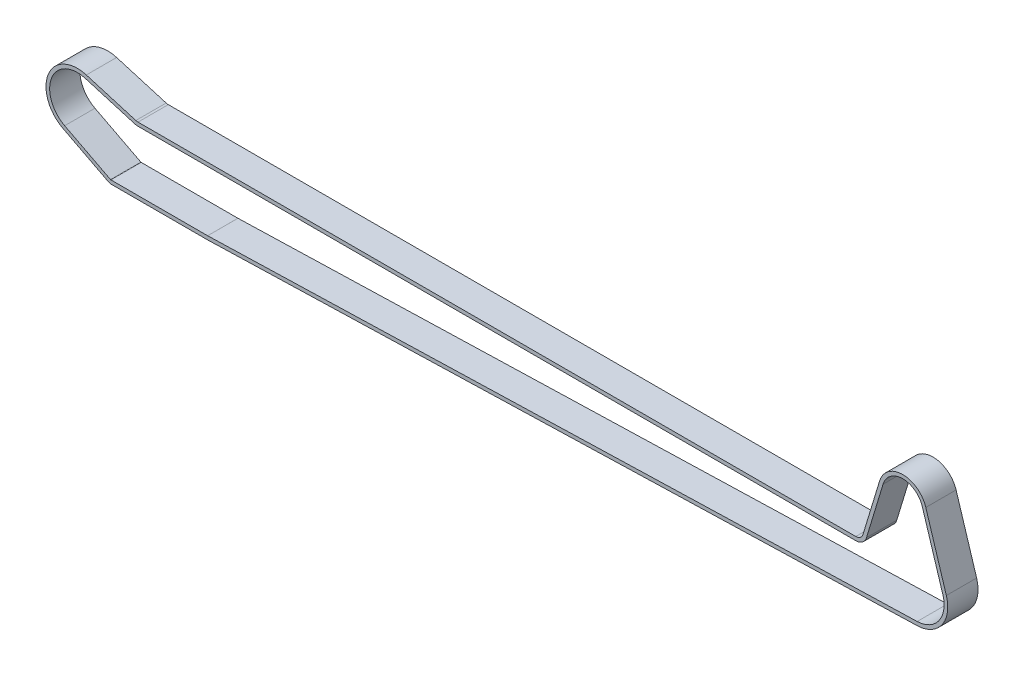
ISO-10303-21;
HEADER;
FILE_DESCRIPTION(('STEP AP214'),'2;1');
FILE_NAME('part.step','',(''),(''),'','','');
FILE_SCHEMA(('AUTOMOTIVE_DESIGN { 1 0 10303 214 1 1 1 1 }'));
ENDSEC;
DATA;
#1=APPLICATION_CONTEXT('core data for automotive mechanical design processes');
#2=APPLICATION_PROTOCOL_DEFINITION('international standard','automotive_design',2000,#1);
#3=PRODUCT_CONTEXT('',#1,'mechanical');
#4=PRODUCT('Part','Part','',(#3));
#5=PRODUCT_RELATED_PRODUCT_CATEGORY('part','',(#4));
#6=PRODUCT_DEFINITION_FORMATION('','',#4);
#7=PRODUCT_DEFINITION_CONTEXT('part definition',#1,'design');
#8=PRODUCT_DEFINITION('design','',#6,#7);
#9=PRODUCT_DEFINITION_SHAPE('','',#8);
#10=(LENGTH_UNIT() NAMED_UNIT(*) SI_UNIT(.MILLI.,.METRE.));
#11=(NAMED_UNIT(*) PLANE_ANGLE_UNIT() SI_UNIT($,.RADIAN.));
#12=(NAMED_UNIT(*) SI_UNIT($,.STERADIAN.) SOLID_ANGLE_UNIT());
#13=UNCERTAINTY_MEASURE_WITH_UNIT(LENGTH_MEASURE(1.E-05),#10,'distance_accuracy_value','');
#14=(GEOMETRIC_REPRESENTATION_CONTEXT(3) GLOBAL_UNCERTAINTY_ASSIGNED_CONTEXT((#13)) GLOBAL_UNIT_ASSIGNED_CONTEXT((#10,
#11,#12)) REPRESENTATION_CONTEXT('',''));
#15=CARTESIAN_POINT('',(0.,0.,0.));
#16=DIRECTION('',(0.,0.,1.));
#17=DIRECTION('',(1.,0.,0.));
#18=AXIS2_PLACEMENT_3D('',#15,#16,#17);
#19=CARTESIAN_POINT('',(134.,22.5,5.));
#20=DIRECTION('',(0.,0.,1.));
#21=DIRECTION('',(1.,0.,0.));
#22=AXIS2_PLACEMENT_3D('',#19,#20,#21);
#23=PLANE('',#22);
#24=DIRECTION('',(1.,0.,0.));
#25=VECTOR('',#24,1.);
#26=CARTESIAN_POINT('',(-127.791520656729,-17.2,5.));
#27=LINE('',#26,#25);
#28=CARTESIAN_POINT('',(-127.427119835818,-17.2,5.));
#29=VERTEX_POINT('',#28);
#30=CARTESIAN_POINT('',(-95.504374774076,-17.2,5.));
#31=VERTEX_POINT('',#30);
#32=EDGE_CURVE('E337',#29,#31,#27,.T.);
#33=ORIENTED_EDGE('',*,*,#32,.T.);
#34=CARTESIAN_POINT('',(-95.504374774076,-15.7,5.));
#35=DIRECTION('',(0.,0.,1.));
#36=DIRECTION('',(1.,0.,0.));
#37=AXIS2_PLACEMENT_3D('',#34,#35,#36);
#38=CIRCLE('',#37,1.5);
#39=CARTESIAN_POINT('',(-95.4606363343705,-17.1993621806929,5.));
#40=VERTEX_POINT('',#39);
#41=EDGE_CURVE('E43',#31,#40,#38,.T.);
#42=ORIENTED_EDGE('',*,*,#41,.T.);
#43=DIRECTION('',(0.999574787128591,0.0291589598036643,0.));
#44=VECTOR('',#43,1.);
#45=CARTESIAN_POINT('',(-95.4825009036976,-17.2,5.));
#46=LINE('',#45,#44);
#47=CARTESIAN_POINT('',(138.802378413164,-10.3655905425235,5.));
#48=VERTEX_POINT('',#47);
#49=EDGE_CURVE('E339',#40,#48,#46,.T.);
#50=ORIENTED_EDGE('',*,*,#49,.T.);
#51=CARTESIAN_POINT('',(138.5,0.,5.));
#52=DIRECTION('',(0.,0.,1.));
#53=DIRECTION('',(-1.,0.,0.));
#54=AXIS2_PLACEMENT_3D('',#51,#52,#53);
#55=CIRCLE('',#54,10.37);
#56=CARTESIAN_POINT('',(148.401478885599,3.08182022156419,5.));
#57=VERTEX_POINT('',#56);
#58=EDGE_CURVE('E341',#48,#57,#55,.T.);
#59=ORIENTED_EDGE('',*,*,#58,.T.);
#60=DIRECTION('',(-0.29718613515566,0.95481956466719,0.));
#61=VECTOR('',#60,1.);
#62=CARTESIAN_POINT('',(141.619460126044,24.8715453585422,5.));
#63=LINE('',#62,#61);
#64=CARTESIAN_POINT('',(141.619460126044,24.8715453585422,5.));
#65=VERTEX_POINT('',#64);
#66=EDGE_CURVE('E343',#57,#65,#63,.T.);
#67=ORIENTED_EDGE('',*,*,#66,.T.);
#68=CARTESIAN_POINT('',(134.,22.5,5.));
#69=DIRECTION('',(0.,0.,1.));
#70=DIRECTION('',(1.,0.,0.));
#71=AXIS2_PLACEMENT_3D('',#68,#69,#70);
#72=CIRCLE('',#71,7.98);
#73=CARTESIAN_POINT('',(126.364584033721,24.819660109132,5.));
#74=VERTEX_POINT('',#73);
#75=EDGE_CURVE('E319',#65,#74,#72,.T.);
#76=ORIENTED_EDGE('',*,*,#75,.T.);
#77=DIRECTION('',(-0.290684224202009,-0.956819043393303,0.));
#78=VECTOR('',#77,1.);
#79=CARTESIAN_POINT('',(120.882047608483,6.77328943949498,5.));
#80=LINE('',#79,#78);
#81=CARTESIAN_POINT('',(120.882047608483,6.77328943949498,5.));
#82=VERTEX_POINT('',#81);
#83=EDGE_CURVE('E322',#74,#82,#80,.T.);
#84=ORIENTED_EDGE('',*,*,#83,.T.);
#85=CARTESIAN_POINT('',(118.49,7.5,5.));
#86=DIRECTION('',(0.,0.,-1.));
#87=DIRECTION('',(-1.,0.,0.));
#88=AXIS2_PLACEMENT_3D('',#85,#86,#87);
#89=CIRCLE('',#88,2.5);
#90=CARTESIAN_POINT('',(118.49,5.,5.));
#91=VERTEX_POINT('',#90);
#92=EDGE_CURVE('E325',#82,#91,#89,.T.);
#93=ORIENTED_EDGE('',*,*,#92,.T.);
#94=DIRECTION('',(-1.,0.,0.));
#95=VECTOR('',#94,1.);
#96=CARTESIAN_POINT('',(-118.49,5.,5.));
#97=LINE('',#96,#95);
#98=CARTESIAN_POINT('',(-118.49,5.,5.));
#99=VERTEX_POINT('',#98);
#100=EDGE_CURVE('E327',#91,#99,#97,.T.);
#101=ORIENTED_EDGE('',*,*,#100,.T.);
#102=CARTESIAN_POINT('',(-118.49,7.5,5.));
#103=DIRECTION('',(0.,0.,-1.));
#104=DIRECTION('',(1.,0.,0.));
#105=AXIS2_PLACEMENT_3D('',#102,#103,#104);
#106=CIRCLE('',#105,2.5);
#107=CARTESIAN_POINT('',(-119.199434764562,5.10277195185128,5.));
#108=VERTEX_POINT('',#107);
#109=EDGE_CURVE('E329',#99,#108,#106,.T.);
#110=ORIENTED_EDGE('',*,*,#109,.T.);
#111=DIRECTION('',(-0.958891219259489,0.283773905824779,0.));
#112=VECTOR('',#111,1.);
#113=CARTESIAN_POINT('',(-135.557264596597,9.9437019437209,5.));
#114=LINE('',#113,#112);
#115=CARTESIAN_POINT('',(-135.557264596597,9.9437019437209,5.));
#116=VERTEX_POINT('',#115);
#117=EDGE_CURVE('E331',#108,#116,#114,.T.);
#118=ORIENTED_EDGE('',*,*,#117,.T.);
#119=CARTESIAN_POINT('',(-138.5,0.,5.));
#120=DIRECTION('',(0.,0.,1.));
#121=DIRECTION('',(1.,0.,0.));
#122=AXIS2_PLACEMENT_3D('',#119,#120,#121);
#123=CIRCLE('',#122,10.37);
#124=CARTESIAN_POINT('',(-143.257666119284,-9.21420170700752,5.));
#125=VERTEX_POINT('',#124);
#126=EDGE_CURVE('E333',#116,#125,#123,.T.);
#127=ORIENTED_EDGE('',*,*,#126,.T.);
#128=DIRECTION('',(0.888544041177196,-0.458791332621376,0.));
#129=VECTOR('',#128,1.);
#130=CARTESIAN_POINT('',(-143.257666119284,-9.21420170700752,5.));
#131=LINE('',#130,#129);
#132=CARTESIAN_POINT('',(-128.11530683475,-17.0328160617658,5.));
#133=VERTEX_POINT('',#132);
#134=EDGE_CURVE('E335',#125,#133,#131,.T.);
#135=ORIENTED_EDGE('',*,*,#134,.T.);
#136=CARTESIAN_POINT('',(-127.427119835818,-15.7,5.));
#137=DIRECTION('',(0.,0.,1.));
#138=DIRECTION('',(1.,0.,0.));
#139=AXIS2_PLACEMENT_3D('',#136,#137,#138);
#140=CIRCLE('',#139,1.5);
#141=EDGE_CURVE('E426',#133,#29,#140,.T.);
#142=ORIENTED_EDGE('',*,*,#141,.T.);
#143=EDGE_LOOP('',(#33,#42,#50,#59,#67,#76,#84,#93,#101,#110,#118,#127,#135,#142));
#144=FACE_BOUND('',#143,.T.);
#145=DIRECTION('',(1.,0.,0.));
#146=VECTOR('',#145,1.);
#147=CARTESIAN_POINT('',(-127.5,-16.,5.));
#148=LINE('',#147,#146);
#149=CARTESIAN_POINT('',(-127.427119835818,-16.,5.));
#150=VERTEX_POINT('',#149);
#151=CARTESIAN_POINT('',(-95.5043747740756,-16.,5.));
#152=VERTEX_POINT('',#151);
#153=EDGE_CURVE('E234',#150,#152,#148,.T.);
#154=ORIENTED_EDGE('',*,*,#153,.F.);
#155=CARTESIAN_POINT('',(-127.427119835818,-15.7,5.));
#156=DIRECTION('',(0.,0.,1.));
#157=DIRECTION('',(1.,0.,0.));
#158=AXIS2_PLACEMENT_3D('',#155,#156,#157);
#159=CIRCLE('',#158,0.3);
#160=CARTESIAN_POINT('',(-127.564757235604,-15.9665632123532,5.));
#161=VERTEX_POINT('',#160);
#162=EDGE_CURVE('E413',#150,#161,#159,.F.);
#163=ORIENTED_EDGE('',*,*,#162,.T.);
#164=DIRECTION('',(0.888544041177196,-0.458791332621376,0.));
#165=VECTOR('',#164,1.);
#166=CARTESIAN_POINT('',(-142.707116520138,-8.14794885759488,5.));
#167=LINE('',#166,#165);
#168=CARTESIAN_POINT('',(-142.707116520138,-8.14794885759489,5.));
#169=VERTEX_POINT('',#168);
#170=EDGE_CURVE('E301',#169,#161,#167,.T.);
#171=ORIENTED_EDGE('',*,*,#170,.F.);
#172=CARTESIAN_POINT('',(-138.5,0.,5.));
#173=DIRECTION('',(0.,0.,1.));
#174=DIRECTION('',(1.,0.,0.));
#175=AXIS2_PLACEMENT_3D('',#172,#173,#174);
#176=CIRCLE('',#175,9.16999999999999);
#177=CARTESIAN_POINT('',(-135.897793283587,8.79303248060951,5.));
#178=VERTEX_POINT('',#177);
#179=EDGE_CURVE('E265',#178,#169,#176,.T.);
#180=ORIENTED_EDGE('',*,*,#179,.F.);
#181=DIRECTION('',(-0.958891219259489,0.283773905824779,0.));
#182=VECTOR('',#181,1.);
#183=CARTESIAN_POINT('',(-135.897793283587,8.79303248060951,5.));
#184=LINE('',#183,#182);
#185=CARTESIAN_POINT('',(-119.539963451552,3.95210248873989,5.));
#186=VERTEX_POINT('',#185);
#187=EDGE_CURVE('E262',#186,#178,#184,.T.);
#188=ORIENTED_EDGE('',*,*,#187,.F.);
#189=CARTESIAN_POINT('',(-118.49,7.5,5.));
#190=DIRECTION('',(0.,0.,-1.));
#191=DIRECTION('',(1.,0.,0.));
#192=AXIS2_PLACEMENT_3D('',#189,#190,#191);
#193=CIRCLE('',#192,3.7);
#194=CARTESIAN_POINT('',(-118.49,3.8,5.));
#195=VERTEX_POINT('',#194);
#196=EDGE_CURVE('E260',#195,#186,#193,.T.);
#197=ORIENTED_EDGE('',*,*,#196,.F.);
#198=DIRECTION('',(-1.,0.,0.));
#199=VECTOR('',#198,1.);
#200=CARTESIAN_POINT('',(-118.49,3.8,5.));
#201=LINE('',#200,#199);
#202=CARTESIAN_POINT('',(118.49,3.80000000000001,5.));
#203=VERTEX_POINT('',#202);
#204=EDGE_CURVE('E258',#203,#195,#201,.T.);
#205=ORIENTED_EDGE('',*,*,#204,.F.);
#206=CARTESIAN_POINT('',(118.49,7.5,5.));
#207=DIRECTION('',(0.,0.,-1.));
#208=DIRECTION('',(-1.,0.,0.));
#209=AXIS2_PLACEMENT_3D('',#206,#207,#208);
#210=CIRCLE('',#209,3.69999999999999);
#211=CARTESIAN_POINT('',(122.030230460555,6.42446837045257,5.));
#212=VERTEX_POINT('',#211);
#213=EDGE_CURVE('E256',#212,#203,#210,.T.);
#214=ORIENTED_EDGE('',*,*,#213,.F.);
#215=DIRECTION('',(-0.290684224202009,-0.956819043393303,0.));
#216=VECTOR('',#215,1.);
#217=CARTESIAN_POINT('',(122.030230460555,6.42446837045257,5.));
#218=LINE('',#217,#216);
#219=CARTESIAN_POINT('',(127.512766885793,24.4708390400896,5.));
#220=VERTEX_POINT('',#219);
#221=EDGE_CURVE('E254',#220,#212,#218,.T.);
#222=ORIENTED_EDGE('',*,*,#221,.F.);
#223=CARTESIAN_POINT('',(134.,22.5,5.));
#224=DIRECTION('',(0.,0.,1.));
#225=DIRECTION('',(1.,0.,0.));
#226=AXIS2_PLACEMENT_3D('',#223,#224,#225);
#227=CIRCLE('',#226,6.77999999999998);
#228=CARTESIAN_POINT('',(140.473676648444,24.5149219963554,5.));
#229=VERTEX_POINT('',#228);
#230=EDGE_CURVE('E249',#229,#220,#227,.T.);
#231=ORIENTED_EDGE('',*,*,#230,.F.);
#232=DIRECTION('',(-0.297186135155662,0.954819564667189,0.));
#233=VECTOR('',#232,1.);
#234=CARTESIAN_POINT('',(140.473676648444,24.5149219963554,5.));
#235=LINE('',#234,#233);
#236=CARTESIAN_POINT('',(147.255695407998,2.7251968593774,5.));
#237=VERTEX_POINT('',#236);
#238=EDGE_CURVE('E247',#237,#229,#235,.T.);
#239=ORIENTED_EDGE('',*,*,#238,.F.);
#240=CARTESIAN_POINT('',(138.5,0.,5.));
#241=DIRECTION('',(0.,0.,1.));
#242=DIRECTION('',(-1.,0.,0.));
#243=AXIS2_PLACEMENT_3D('',#240,#241,#242);
#244=CIRCLE('',#243,9.16999999999999);
#245=CARTESIAN_POINT('',(138.7673876614,-9.16610079796918,5.));
#246=VERTEX_POINT('',#245);
#247=EDGE_CURVE('E233',#246,#237,#244,.T.);
#248=ORIENTED_EDGE('',*,*,#247,.F.);
#249=DIRECTION('',(0.999574787128591,0.0291589598036644,0.));
#250=VECTOR('',#249,1.);
#251=CARTESIAN_POINT('',(-95.5,-16.,5.));
#252=LINE('',#251,#250);
#253=CARTESIAN_POINT('',(-95.4956270861345,-15.9998724361386,5.));
#254=VERTEX_POINT('',#253);
#255=EDGE_CURVE('E222',#254,#246,#252,.T.);
#256=ORIENTED_EDGE('',*,*,#255,.F.);
#257=CARTESIAN_POINT('',(-95.5043747740756,-15.7,5.));
#258=DIRECTION('',(0.,0.,1.));
#259=DIRECTION('',(1.,0.,0.));
#260=AXIS2_PLACEMENT_3D('',#257,#258,#259);
#261=CIRCLE('',#260,0.3);
#262=EDGE_CURVE('E409',#254,#152,#261,.F.);
#263=ORIENTED_EDGE('',*,*,#262,.T.);
#264=EDGE_LOOP('',(#154,#163,#171,#180,#188,#197,#205,#214,#222,#231,#239,#248,#256,#263));
#265=FACE_BOUND('',#264,.T.);
#266=ADVANCED_FACE('F35',(#144,#265),#23,.T.);
#267=CARTESIAN_POINT('',(134.,22.5,-5.));
#268=DIRECTION('',(0.,0.,1.));
#269=DIRECTION('',(1.,0.,0.));
#270=AXIS2_PLACEMENT_3D('',#267,#268,#269);
#271=PLANE('',#270);
#272=DIRECTION('',(0.999574787128591,0.0291589598036643,0.));
#273=VECTOR('',#272,1.);
#274=CARTESIAN_POINT('',(-95.4825009036976,-17.2,-5.));
#275=LINE('',#274,#273);
#276=CARTESIAN_POINT('',(-95.4606363343705,-17.1993621806929,-5.));
#277=VERTEX_POINT('',#276);
#278=CARTESIAN_POINT('',(138.802378413164,-10.3655905425235,-5.));
#279=VERTEX_POINT('',#278);
#280=EDGE_CURVE('E364',#277,#279,#275,.T.);
#281=ORIENTED_EDGE('',*,*,#280,.F.);
#282=CARTESIAN_POINT('',(-95.504374774076,-15.7,-5.));
#283=DIRECTION('',(0.,0.,1.));
#284=DIRECTION('',(1.,0.,0.));
#285=AXIS2_PLACEMENT_3D('',#282,#283,#284);
#286=CIRCLE('',#285,1.5);
#287=CARTESIAN_POINT('',(-95.504374774076,-17.2,-5.));
#288=VERTEX_POINT('',#287);
#289=EDGE_CURVE('E420',#277,#288,#286,.F.);
#290=ORIENTED_EDGE('',*,*,#289,.T.);
#291=DIRECTION('',(1.,0.,0.));
#292=VECTOR('',#291,1.);
#293=CARTESIAN_POINT('',(-127.791520656729,-17.2,-5.));
#294=LINE('',#293,#292);
#295=CARTESIAN_POINT('',(-127.427119835818,-17.2,-5.));
#296=VERTEX_POINT('',#295);
#297=EDGE_CURVE('E362',#296,#288,#294,.T.);
#298=ORIENTED_EDGE('',*,*,#297,.F.);
#299=CARTESIAN_POINT('',(-127.427119835818,-15.7,-5.));
#300=DIRECTION('',(0.,0.,1.));
#301=DIRECTION('',(1.,0.,0.));
#302=AXIS2_PLACEMENT_3D('',#299,#300,#301);
#303=CIRCLE('',#302,1.5);
#304=CARTESIAN_POINT('',(-128.11530683475,-17.0328160617658,-5.));
#305=VERTEX_POINT('',#304);
#306=EDGE_CURVE('E418',#296,#305,#303,.F.);
#307=ORIENTED_EDGE('',*,*,#306,.T.);
#308=DIRECTION('',(0.888544041177196,-0.458791332621376,0.));
#309=VECTOR('',#308,1.);
#310=CARTESIAN_POINT('',(-143.257666119284,-9.21420170700752,-5.));
#311=LINE('',#310,#309);
#312=CARTESIAN_POINT('',(-143.257666119284,-9.21420170700752,-5.));
#313=VERTEX_POINT('',#312);
#314=EDGE_CURVE('E360',#313,#305,#311,.T.);
#315=ORIENTED_EDGE('',*,*,#314,.F.);
#316=CARTESIAN_POINT('',(-138.5,0.,-5.));
#317=DIRECTION('',(0.,0.,1.));
#318=DIRECTION('',(1.,0.,0.));
#319=AXIS2_PLACEMENT_3D('',#316,#317,#318);
#320=CIRCLE('',#319,10.37);
#321=CARTESIAN_POINT('',(-135.557264596597,9.9437019437209,-5.));
#322=VERTEX_POINT('',#321);
#323=EDGE_CURVE('E358',#322,#313,#320,.T.);
#324=ORIENTED_EDGE('',*,*,#323,.F.);
#325=DIRECTION('',(-0.958891219259489,0.283773905824779,0.));
#326=VECTOR('',#325,1.);
#327=CARTESIAN_POINT('',(-135.557264596597,9.9437019437209,-5.));
#328=LINE('',#327,#326);
#329=CARTESIAN_POINT('',(-119.199434764562,5.10277195185128,-5.));
#330=VERTEX_POINT('',#329);
#331=EDGE_CURVE('E356',#330,#322,#328,.T.);
#332=ORIENTED_EDGE('',*,*,#331,.F.);
#333=CARTESIAN_POINT('',(-118.49,7.5,-5.));
#334=DIRECTION('',(0.,0.,-1.));
#335=DIRECTION('',(1.,0.,0.));
#336=AXIS2_PLACEMENT_3D('',#333,#334,#335);
#337=CIRCLE('',#336,2.5);
#338=CARTESIAN_POINT('',(-118.49,5.,-5.));
#339=VERTEX_POINT('',#338);
#340=EDGE_CURVE('E354',#339,#330,#337,.T.);
#341=ORIENTED_EDGE('',*,*,#340,.F.);
#342=DIRECTION('',(-1.,0.,0.));
#343=VECTOR('',#342,1.);
#344=CARTESIAN_POINT('',(-118.49,5.,-5.));
#345=LINE('',#344,#343);
#346=CARTESIAN_POINT('',(118.49,5.,-5.));
#347=VERTEX_POINT('',#346);
#348=EDGE_CURVE('E352',#347,#339,#345,.T.);
#349=ORIENTED_EDGE('',*,*,#348,.F.);
#350=CARTESIAN_POINT('',(118.49,7.5,-5.));
#351=DIRECTION('',(0.,0.,-1.));
#352=DIRECTION('',(-1.,0.,0.));
#353=AXIS2_PLACEMENT_3D('',#350,#351,#352);
#354=CIRCLE('',#353,2.5);
#355=CARTESIAN_POINT('',(120.882047608483,6.77328943949498,-5.));
#356=VERTEX_POINT('',#355);
#357=EDGE_CURVE('E350',#356,#347,#354,.T.);
#358=ORIENTED_EDGE('',*,*,#357,.F.);
#359=DIRECTION('',(-0.290684224202009,-0.956819043393303,0.));
#360=VECTOR('',#359,1.);
#361=CARTESIAN_POINT('',(120.882047608483,6.77328943949498,-5.));
#362=LINE('',#361,#360);
#363=CARTESIAN_POINT('',(126.364584033721,24.819660109132,-5.));
#364=VERTEX_POINT('',#363);
#365=EDGE_CURVE('E348',#364,#356,#362,.T.);
#366=ORIENTED_EDGE('',*,*,#365,.F.);
#367=CARTESIAN_POINT('',(134.,22.5,-5.));
#368=DIRECTION('',(0.,0.,1.));
#369=DIRECTION('',(1.,0.,0.));
#370=AXIS2_PLACEMENT_3D('',#367,#368,#369);
#371=CIRCLE('',#370,7.98);
#372=CARTESIAN_POINT('',(141.619460126044,24.8715453585422,-5.));
#373=VERTEX_POINT('',#372);
#374=EDGE_CURVE('E241',#373,#364,#371,.T.);
#375=ORIENTED_EDGE('',*,*,#374,.F.);
#376=DIRECTION('',(-0.29718613515566,0.95481956466719,0.));
#377=VECTOR('',#376,1.);
#378=CARTESIAN_POINT('',(141.619460126044,24.8715453585422,-5.));
#379=LINE('',#378,#377);
#380=CARTESIAN_POINT('',(148.401478885599,3.08182022156419,-5.));
#381=VERTEX_POINT('',#380);
#382=EDGE_CURVE('E323',#381,#373,#379,.T.);
#383=ORIENTED_EDGE('',*,*,#382,.F.);
#384=CARTESIAN_POINT('',(138.5,0.,-5.));
#385=DIRECTION('',(0.,0.,1.));
#386=DIRECTION('',(-1.,0.,0.));
#387=AXIS2_PLACEMENT_3D('',#384,#385,#386);
#388=CIRCLE('',#387,10.37);
#389=EDGE_CURVE('E366',#279,#381,#388,.T.);
#390=ORIENTED_EDGE('',*,*,#389,.F.);
#391=EDGE_LOOP('',(#281,#290,#298,#307,#315,#324,#332,#341,#349,#358,#366,#375,#383,#390));
#392=FACE_BOUND('',#391,.T.);
#393=DIRECTION('',(0.888544041177196,-0.458791332621376,0.));
#394=VECTOR('',#393,1.);
#395=CARTESIAN_POINT('',(-142.707116520138,-8.14794885759488,-5.));
#396=LINE('',#395,#394);
#397=CARTESIAN_POINT('',(-142.707116520138,-8.14794885759489,-5.));
#398=VERTEX_POINT('',#397);
#399=CARTESIAN_POINT('',(-127.564757235604,-15.9665632123532,-5.));
#400=VERTEX_POINT('',#399);
#401=EDGE_CURVE('E268',#398,#400,#396,.T.);
#402=ORIENTED_EDGE('',*,*,#401,.T.);
#403=CARTESIAN_POINT('',(-127.427119835818,-15.7,-5.));
#404=DIRECTION('',(0.,0.,1.));
#405=DIRECTION('',(1.,0.,0.));
#406=AXIS2_PLACEMENT_3D('',#403,#404,#405);
#407=CIRCLE('',#406,0.3);
#408=CARTESIAN_POINT('',(-127.427119835818,-16.,-5.));
#409=VERTEX_POINT('',#408);
#410=EDGE_CURVE('E411',#400,#409,#407,.T.);
#411=ORIENTED_EDGE('',*,*,#410,.T.);
#412=DIRECTION('',(1.,0.,0.));
#413=VECTOR('',#412,1.);
#414=CARTESIAN_POINT('',(-127.5,-16.,-5.));
#415=LINE('',#414,#413);
#416=CARTESIAN_POINT('',(-95.5043747740756,-16.,-5.));
#417=VERTEX_POINT('',#416);
#418=EDGE_CURVE('E271',#409,#417,#415,.T.);
#419=ORIENTED_EDGE('',*,*,#418,.T.);
#420=CARTESIAN_POINT('',(-95.5043747740756,-15.7,-5.));
#421=DIRECTION('',(0.,0.,1.));
#422=DIRECTION('',(1.,0.,0.));
#423=AXIS2_PLACEMENT_3D('',#420,#421,#422);
#424=CIRCLE('',#423,0.3);
#425=CARTESIAN_POINT('',(-95.4956270861345,-15.9998724361386,-5.));
#426=VERTEX_POINT('',#425);
#427=EDGE_CURVE('E407',#417,#426,#424,.T.);
#428=ORIENTED_EDGE('',*,*,#427,.T.);
#429=DIRECTION('',(0.999574787128591,0.0291589598036644,0.));
#430=VECTOR('',#429,1.);
#431=CARTESIAN_POINT('',(-95.5,-16.,-5.));
#432=LINE('',#431,#430);
#433=CARTESIAN_POINT('',(138.7673876614,-9.16610079796918,-5.));
#434=VERTEX_POINT('',#433);
#435=EDGE_CURVE('E274',#426,#434,#432,.T.);
#436=ORIENTED_EDGE('',*,*,#435,.T.);
#437=CARTESIAN_POINT('',(138.5,0.,-5.));
#438=DIRECTION('',(0.,0.,1.));
#439=DIRECTION('',(-1.,0.,0.));
#440=AXIS2_PLACEMENT_3D('',#437,#438,#439);
#441=CIRCLE('',#440,9.16999999999999);
#442=CARTESIAN_POINT('',(147.255695407998,2.7251968593774,-5.));
#443=VERTEX_POINT('',#442);
#444=EDGE_CURVE('E240',#434,#443,#441,.T.);
#445=ORIENTED_EDGE('',*,*,#444,.T.);
#446=DIRECTION('',(-0.297186135155662,0.954819564667189,0.));
#447=VECTOR('',#446,1.);
#448=CARTESIAN_POINT('',(140.473676648444,24.5149219963554,-5.));
#449=LINE('',#448,#447);
#450=CARTESIAN_POINT('',(140.473676648444,24.5149219963554,-5.));
#451=VERTEX_POINT('',#450);
#452=EDGE_CURVE('E277',#443,#451,#449,.T.);
#453=ORIENTED_EDGE('',*,*,#452,.T.);
#454=CARTESIAN_POINT('',(134.,22.5,-5.));
#455=DIRECTION('',(0.,0.,1.));
#456=DIRECTION('',(1.,0.,0.));
#457=AXIS2_PLACEMENT_3D('',#454,#455,#456);
#458=CIRCLE('',#457,6.77999999999998);
#459=CARTESIAN_POINT('',(127.512766885793,24.4708390400896,-5.));
#460=VERTEX_POINT('',#459);
#461=EDGE_CURVE('E280',#451,#460,#458,.T.);
#462=ORIENTED_EDGE('',*,*,#461,.T.);
#463=DIRECTION('',(-0.290684224202009,-0.956819043393303,0.));
#464=VECTOR('',#463,1.);
#465=CARTESIAN_POINT('',(122.030230460555,6.42446837045257,-5.));
#466=LINE('',#465,#464);
#467=CARTESIAN_POINT('',(122.030230460555,6.42446837045257,-5.));
#468=VERTEX_POINT('',#467);
#469=EDGE_CURVE('E283',#460,#468,#466,.T.);
#470=ORIENTED_EDGE('',*,*,#469,.T.);
#471=CARTESIAN_POINT('',(118.49,7.5,-5.));
#472=DIRECTION('',(0.,0.,-1.));
#473=DIRECTION('',(-1.,0.,0.));
#474=AXIS2_PLACEMENT_3D('',#471,#472,#473);
#475=CIRCLE('',#474,3.69999999999999);
#476=CARTESIAN_POINT('',(118.49,3.80000000000001,-5.));
#477=VERTEX_POINT('',#476);
#478=EDGE_CURVE('E286',#468,#477,#475,.T.);
#479=ORIENTED_EDGE('',*,*,#478,.T.);
#480=DIRECTION('',(-1.,0.,0.));
#481=VECTOR('',#480,1.);
#482=CARTESIAN_POINT('',(-118.49,3.8,-5.));
#483=LINE('',#482,#481);
#484=CARTESIAN_POINT('',(-118.49,3.8,-5.));
#485=VERTEX_POINT('',#484);
#486=EDGE_CURVE('E289',#477,#485,#483,.T.);
#487=ORIENTED_EDGE('',*,*,#486,.T.);
#488=CARTESIAN_POINT('',(-118.49,7.5,-5.));
#489=DIRECTION('',(0.,0.,-1.));
#490=DIRECTION('',(1.,0.,0.));
#491=AXIS2_PLACEMENT_3D('',#488,#489,#490);
#492=CIRCLE('',#491,3.7);
#493=CARTESIAN_POINT('',(-119.539963451552,3.95210248873989,-5.));
#494=VERTEX_POINT('',#493);
#495=EDGE_CURVE('E292',#485,#494,#492,.T.);
#496=ORIENTED_EDGE('',*,*,#495,.T.);
#497=DIRECTION('',(-0.958891219259489,0.283773905824779,0.));
#498=VECTOR('',#497,1.);
#499=CARTESIAN_POINT('',(-135.897793283587,8.79303248060951,-5.));
#500=LINE('',#499,#498);
#501=CARTESIAN_POINT('',(-135.897793283587,8.79303248060951,-5.));
#502=VERTEX_POINT('',#501);
#503=EDGE_CURVE('E295',#494,#502,#500,.T.);
#504=ORIENTED_EDGE('',*,*,#503,.T.);
#505=CARTESIAN_POINT('',(-138.5,0.,-5.));
#506=DIRECTION('',(0.,0.,1.));
#507=DIRECTION('',(1.,0.,0.));
#508=AXIS2_PLACEMENT_3D('',#505,#506,#507);
#509=CIRCLE('',#508,9.16999999999999);
#510=EDGE_CURVE('E298',#502,#398,#509,.T.);
#511=ORIENTED_EDGE('',*,*,#510,.T.);
#512=EDGE_LOOP('',(#402,#411,#419,#428,#436,#445,#453,#462,#470,#479,#487,#496,#504,#511));
#513=FACE_BOUND('',#512,.T.);
#514=ADVANCED_FACE('F440',(#392,#513),#271,.F.);
#515=CARTESIAN_POINT('',(134.,22.5,5.));
#516=DIRECTION('',(0.,0.,-1.));
#517=DIRECTION('',(-1.,0.,0.));
#518=AXIS2_PLACEMENT_3D('',#515,#516,#517);
#519=CYLINDRICAL_SURFACE('',#518,7.98);
#520=ORIENTED_EDGE('',*,*,#374,.T.);
#521=DIRECTION('',(0.,0.,-1.));
#522=VECTOR('',#521,1.);
#523=CARTESIAN_POINT('',(126.364584033721,24.819660109132,5.));
#524=LINE('',#523,#522);
#525=EDGE_CURVE('E395',#74,#364,#524,.T.);
#526=ORIENTED_EDGE('',*,*,#525,.F.);
#527=ORIENTED_EDGE('',*,*,#75,.F.);
#528=DIRECTION('',(0.,0.,-1.));
#529=VECTOR('',#528,1.);
#530=CARTESIAN_POINT('',(141.619460126044,24.8715453585422,5.));
#531=LINE('',#530,#529);
#532=EDGE_CURVE('E345',#65,#373,#531,.T.);
#533=ORIENTED_EDGE('',*,*,#532,.T.);
#534=EDGE_LOOP('',(#520,#526,#527,#533));
#535=FACE_BOUND('',#534,.T.);
#536=ADVANCED_FACE('F481',(#535),#519,.T.);
#537=CARTESIAN_POINT('',(120.882047608483,6.77328943949498,5.));
#538=DIRECTION('',(0.956819043393303,-0.290684224202009,0.));
#539=DIRECTION('',(0.290684224202009,0.956819043393303,0.));
#540=AXIS2_PLACEMENT_3D('',#537,#538,#539);
#541=PLANE('',#540);
#542=ORIENTED_EDGE('',*,*,#365,.T.);
#543=DIRECTION('',(0.,0.,-1.));
#544=VECTOR('',#543,1.);
#545=CARTESIAN_POINT('',(120.882047608483,6.77328943949498,5.));
#546=LINE('',#545,#544);
#547=EDGE_CURVE('E392',#82,#356,#546,.T.);
#548=ORIENTED_EDGE('',*,*,#547,.F.);
#549=ORIENTED_EDGE('',*,*,#83,.F.);
#550=ORIENTED_EDGE('',*,*,#525,.T.);
#551=EDGE_LOOP('',(#542,#548,#549,#550));
#552=FACE_BOUND('',#551,.T.);
#553=ADVANCED_FACE('F477',(#552),#541,.F.);
#554=CARTESIAN_POINT('',(118.49,7.5,5.));
#555=DIRECTION('',(0.,0.,-1.));
#556=DIRECTION('',(-1.,0.,0.));
#557=AXIS2_PLACEMENT_3D('',#554,#555,#556);
#558=CYLINDRICAL_SURFACE('',#557,2.5);
#559=ORIENTED_EDGE('',*,*,#357,.T.);
#560=DIRECTION('',(0.,0.,-1.));
#561=VECTOR('',#560,1.);
#562=CARTESIAN_POINT('',(118.49,5.,5.));
#563=LINE('',#562,#561);
#564=EDGE_CURVE('E389',#91,#347,#563,.T.);
#565=ORIENTED_EDGE('',*,*,#564,.F.);
#566=ORIENTED_EDGE('',*,*,#92,.F.);
#567=ORIENTED_EDGE('',*,*,#547,.T.);
#568=EDGE_LOOP('',(#559,#565,#566,#567));
#569=FACE_BOUND('',#568,.T.);
#570=ADVANCED_FACE('F473',(#569),#558,.F.);
#571=CARTESIAN_POINT('',(-118.49,5.,5.));
#572=DIRECTION('',(0.,-1.,0.));
#573=DIRECTION('',(0.,0.,-1.));
#574=AXIS2_PLACEMENT_3D('',#571,#572,#573);
#575=PLANE('',#574);
#576=ORIENTED_EDGE('',*,*,#348,.T.);
#577=DIRECTION('',(0.,0.,-1.));
#578=VECTOR('',#577,1.);
#579=CARTESIAN_POINT('',(-118.49,5.,5.));
#580=LINE('',#579,#578);
#581=EDGE_CURVE('E386',#99,#339,#580,.T.);
#582=ORIENTED_EDGE('',*,*,#581,.F.);
#583=ORIENTED_EDGE('',*,*,#100,.F.);
#584=ORIENTED_EDGE('',*,*,#564,.T.);
#585=EDGE_LOOP('',(#576,#582,#583,#584));
#586=FACE_BOUND('',#585,.T.);
#587=ADVANCED_FACE('F468',(#586),#575,.F.);
#588=CARTESIAN_POINT('',(-118.49,7.5,5.));
#589=DIRECTION('',(0.,0.,-1.));
#590=DIRECTION('',(-1.,0.,0.));
#591=AXIS2_PLACEMENT_3D('',#588,#589,#590);
#592=CYLINDRICAL_SURFACE('',#591,2.5);
#593=ORIENTED_EDGE('',*,*,#340,.T.);
#594=DIRECTION('',(0.,0.,-1.));
#595=VECTOR('',#594,1.);
#596=CARTESIAN_POINT('',(-119.199434764562,5.10277195185128,5.));
#597=LINE('',#596,#595);
#598=EDGE_CURVE('E383',#108,#330,#597,.T.);
#599=ORIENTED_EDGE('',*,*,#598,.F.);
#600=ORIENTED_EDGE('',*,*,#109,.F.);
#601=ORIENTED_EDGE('',*,*,#581,.T.);
#602=EDGE_LOOP('',(#593,#599,#600,#601));
#603=FACE_BOUND('',#602,.T.);
#604=ADVANCED_FACE('F464',(#603),#592,.F.);
#605=CARTESIAN_POINT('',(-135.557264596597,9.9437019437209,5.));
#606=DIRECTION('',(-0.283773905824779,-0.958891219259489,0.));
#607=DIRECTION('',(0.958891219259489,-0.283773905824779,0.));
#608=AXIS2_PLACEMENT_3D('',#605,#606,#607);
#609=PLANE('',#608);
#610=ORIENTED_EDGE('',*,*,#331,.T.);
#611=DIRECTION('',(0.,0.,-1.));
#612=VECTOR('',#611,1.);
#613=CARTESIAN_POINT('',(-135.557264596597,9.9437019437209,5.));
#614=LINE('',#613,#612);
#615=EDGE_CURVE('E380',#116,#322,#614,.T.);
#616=ORIENTED_EDGE('',*,*,#615,.F.);
#617=ORIENTED_EDGE('',*,*,#117,.F.);
#618=ORIENTED_EDGE('',*,*,#598,.T.);
#619=EDGE_LOOP('',(#610,#616,#617,#618));
#620=FACE_BOUND('',#619,.T.);
#621=ADVANCED_FACE('F459',(#620),#609,.F.);
#622=CARTESIAN_POINT('',(-138.5,0.,5.));
#623=DIRECTION('',(0.,0.,-1.));
#624=DIRECTION('',(-1.,0.,0.));
#625=AXIS2_PLACEMENT_3D('',#622,#623,#624);
#626=CYLINDRICAL_SURFACE('',#625,10.37);
#627=ORIENTED_EDGE('',*,*,#323,.T.);
#628=DIRECTION('',(0.,0.,-1.));
#629=VECTOR('',#628,1.);
#630=CARTESIAN_POINT('',(-143.257666119284,-9.21420170700752,5.));
#631=LINE('',#630,#629);
#632=EDGE_CURVE('E377',#125,#313,#631,.T.);
#633=ORIENTED_EDGE('',*,*,#632,.F.);
#634=ORIENTED_EDGE('',*,*,#126,.F.);
#635=ORIENTED_EDGE('',*,*,#615,.T.);
#636=EDGE_LOOP('',(#627,#633,#634,#635));
#637=FACE_BOUND('',#636,.T.);
#638=ADVANCED_FACE('F453',(#637),#626,.T.);
#639=CARTESIAN_POINT('',(-143.257666119284,-9.21420170700752,5.));
#640=DIRECTION('',(0.458791332621376,0.888544041177196,0.));
#641=DIRECTION('',(-0.888544041177196,0.458791332621376,0.));
#642=AXIS2_PLACEMENT_3D('',#639,#640,#641);
#643=PLANE('',#642);
#644=ORIENTED_EDGE('',*,*,#314,.T.);
#645=DIRECTION('',(0.,0.,-1.));
#646=VECTOR('',#645,1.);
#647=CARTESIAN_POINT('',(-128.11530683475,-17.0328160617658,5.));
#648=LINE('',#647,#646);
#649=EDGE_CURVE('E11',#305,#133,#648,.F.);
#650=ORIENTED_EDGE('',*,*,#649,.T.);
#651=ORIENTED_EDGE('',*,*,#134,.F.);
#652=ORIENTED_EDGE('',*,*,#632,.T.);
#653=EDGE_LOOP('',(#644,#650,#651,#652));
#654=FACE_BOUND('',#653,.T.);
#655=ADVANCED_FACE('F449',(#654),#643,.F.);
#656=CARTESIAN_POINT('',(-127.791520656729,-17.2,5.));
#657=DIRECTION('',(0.,1.,0.));
#658=DIRECTION('',(0.,0.,1.));
#659=AXIS2_PLACEMENT_3D('',#656,#657,#658);
#660=PLANE('',#659);
#661=ORIENTED_EDGE('',*,*,#297,.T.);
#662=DIRECTION('',(0.,0.,-1.));
#663=VECTOR('',#662,1.);
#664=CARTESIAN_POINT('',(-95.504374774076,-17.2,5.));
#665=LINE('',#664,#663);
#666=EDGE_CURVE('E56',#288,#31,#665,.F.);
#667=ORIENTED_EDGE('',*,*,#666,.T.);
#668=ORIENTED_EDGE('',*,*,#32,.F.);
#669=DIRECTION('',(0.,0.,-1.));
#670=VECTOR('',#669,1.);
#671=CARTESIAN_POINT('',(-127.427119835818,-17.2,5.));
#672=LINE('',#671,#670);
#673=EDGE_CURVE('E422',#29,#296,#672,.T.);
#674=ORIENTED_EDGE('',*,*,#673,.T.);
#675=EDGE_LOOP('',(#661,#667,#668,#674));
#676=FACE_BOUND('',#675,.T.);
#677=ADVANCED_FACE('F443',(#676),#660,.F.);
#678=CARTESIAN_POINT('',(-95.4825009036976,-17.2,5.));
#679=DIRECTION('',(-0.0291589598036643,0.999574787128591,0.));
#680=DIRECTION('',(-0.999574787128591,-0.0291589598036643,0.));
#681=AXIS2_PLACEMENT_3D('',#678,#679,#680);
#682=PLANE('',#681);
#683=ORIENTED_EDGE('',*,*,#49,.F.);
#684=DIRECTION('',(0.,0.,-1.));
#685=VECTOR('',#684,1.);
#686=CARTESIAN_POINT('',(-95.4606363343705,-17.1993621806929,5.));
#687=LINE('',#686,#685);
#688=EDGE_CURVE('E415',#40,#277,#687,.T.);
#689=ORIENTED_EDGE('',*,*,#688,.T.);
#690=ORIENTED_EDGE('',*,*,#280,.T.);
#691=DIRECTION('',(0.,0.,-1.));
#692=VECTOR('',#691,1.);
#693=CARTESIAN_POINT('',(138.802378413164,-10.3655905425235,5.));
#694=LINE('',#693,#692);
#695=EDGE_CURVE('E374',#48,#279,#694,.T.);
#696=ORIENTED_EDGE('',*,*,#695,.F.);
#697=EDGE_LOOP('',(#683,#689,#690,#696));
#698=FACE_BOUND('',#697,.T.);
#699=ADVANCED_FACE('F434',(#698),#682,.F.);
#700=CARTESIAN_POINT('',(138.5,0.,5.));
#701=DIRECTION('',(0.,0.,-1.));
#702=DIRECTION('',(-1.,0.,0.));
#703=AXIS2_PLACEMENT_3D('',#700,#701,#702);
#704=CYLINDRICAL_SURFACE('',#703,10.37);
#705=ORIENTED_EDGE('',*,*,#389,.T.);
#706=DIRECTION('',(0.,0.,-1.));
#707=VECTOR('',#706,1.);
#708=CARTESIAN_POINT('',(148.401478885599,3.08182022156419,5.));
#709=LINE('',#708,#707);
#710=EDGE_CURVE('E371',#57,#381,#709,.T.);
#711=ORIENTED_EDGE('',*,*,#710,.F.);
#712=ORIENTED_EDGE('',*,*,#58,.F.);
#713=ORIENTED_EDGE('',*,*,#695,.T.);
#714=EDGE_LOOP('',(#705,#711,#712,#713));
#715=FACE_BOUND('',#714,.T.);
#716=ADVANCED_FACE('F489',(#715),#704,.T.);
#717=CARTESIAN_POINT('',(141.619460126044,24.8715453585422,5.));
#718=DIRECTION('',(-0.95481956466719,-0.29718613515566,0.));
#719=DIRECTION('',(0.29718613515566,-0.95481956466719,0.));
#720=AXIS2_PLACEMENT_3D('',#717,#718,#719);
#721=PLANE('',#720);
#722=ORIENTED_EDGE('',*,*,#382,.T.);
#723=ORIENTED_EDGE('',*,*,#532,.F.);
#724=ORIENTED_EDGE('',*,*,#66,.F.);
#725=ORIENTED_EDGE('',*,*,#710,.T.);
#726=EDGE_LOOP('',(#722,#723,#724,#725));
#727=FACE_BOUND('',#726,.T.);
#728=ADVANCED_FACE('F485',(#727),#721,.F.);
#729=CARTESIAN_POINT('',(-142.707116520138,-8.14794885759488,5.));
#730=DIRECTION('',(0.458791332621376,0.888544041177196,0.));
#731=DIRECTION('',(-0.888544041177196,0.458791332621376,0.));
#732=AXIS2_PLACEMENT_3D('',#729,#730,#731);
#733=PLANE('',#732);
#734=ORIENTED_EDGE('',*,*,#170,.T.);
#735=DIRECTION('',(0.,0.,-1.));
#736=VECTOR('',#735,1.);
#737=CARTESIAN_POINT('',(-127.564757235604,-15.9665632123532,-5.));
#738=LINE('',#737,#736);
#739=EDGE_CURVE('E404',#161,#400,#738,.T.);
#740=ORIENTED_EDGE('',*,*,#739,.T.);
#741=ORIENTED_EDGE('',*,*,#401,.F.);
#742=DIRECTION('',(0.,0.,-1.));
#743=VECTOR('',#742,1.);
#744=CARTESIAN_POINT('',(-142.707116520138,-8.14794885759489,5.));
#745=LINE('',#744,#743);
#746=EDGE_CURVE('E267',#169,#398,#745,.T.);
#747=ORIENTED_EDGE('',*,*,#746,.F.);
#748=EDGE_LOOP('',(#734,#740,#741,#747));
#749=FACE_BOUND('',#748,.T.);
#750=ADVANCED_FACE('F496',(#749),#733,.T.);
#751=CARTESIAN_POINT('',(-127.5,-16.,5.));
#752=DIRECTION('',(0.,1.,0.));
#753=DIRECTION('',(-1.,0.,0.));
#754=AXIS2_PLACEMENT_3D('',#751,#752,#753);
#755=PLANE('',#754);
#756=ORIENTED_EDGE('',*,*,#153,.T.);
#757=DIRECTION('',(0.,0.,-1.));
#758=VECTOR('',#757,1.);
#759=CARTESIAN_POINT('',(-95.5043747740756,-16.,-5.));
#760=LINE('',#759,#758);
#761=EDGE_CURVE('E400',#152,#417,#760,.T.);
#762=ORIENTED_EDGE('',*,*,#761,.T.);
#763=ORIENTED_EDGE('',*,*,#418,.F.);
#764=DIRECTION('',(0.,0.,-1.));
#765=VECTOR('',#764,1.);
#766=CARTESIAN_POINT('',(-127.427119835818,-16.,5.));
#767=LINE('',#766,#765);
#768=EDGE_CURVE('E398',#409,#150,#767,.F.);
#769=ORIENTED_EDGE('',*,*,#768,.T.);
#770=EDGE_LOOP('',(#756,#762,#763,#769));
#771=FACE_BOUND('',#770,.T.);
#772=ADVANCED_FACE('F508',(#771),#755,.T.);
#773=CARTESIAN_POINT('',(-95.5,-16.,5.));
#774=DIRECTION('',(-0.0291589598036644,0.999574787128591,0.));
#775=DIRECTION('',(-0.999574787128591,-0.0291589598036644,0.));
#776=AXIS2_PLACEMENT_3D('',#773,#774,#775);
#777=PLANE('',#776);
#778=ORIENTED_EDGE('',*,*,#435,.F.);
#779=DIRECTION('',(0.,0.,-1.));
#780=VECTOR('',#779,1.);
#781=CARTESIAN_POINT('',(-95.4956270861345,-15.9998724361386,5.));
#782=LINE('',#781,#780);
#783=EDGE_CURVE('E229',#426,#254,#782,.F.);
#784=ORIENTED_EDGE('',*,*,#783,.T.);
#785=ORIENTED_EDGE('',*,*,#255,.T.);
#786=DIRECTION('',(0.,0.,-1.));
#787=VECTOR('',#786,1.);
#788=CARTESIAN_POINT('',(138.7673876614,-9.16610079796918,5.));
#789=LINE('',#788,#787);
#790=EDGE_CURVE('E226',#246,#434,#789,.T.);
#791=ORIENTED_EDGE('',*,*,#790,.T.);
#792=EDGE_LOOP('',(#778,#784,#785,#791));
#793=FACE_BOUND('',#792,.T.);
#794=ADVANCED_FACE('F225',(#793),#777,.T.);
#795=CARTESIAN_POINT('',(138.5,0.,5.));
#796=DIRECTION('',(0.,0.,-1.));
#797=DIRECTION('',(-1.,0.,0.));
#798=AXIS2_PLACEMENT_3D('',#795,#796,#797);
#799=CYLINDRICAL_SURFACE('',#798,9.16999999999999);
#800=ORIENTED_EDGE('',*,*,#444,.F.);
#801=ORIENTED_EDGE('',*,*,#790,.F.);
#802=ORIENTED_EDGE('',*,*,#247,.T.);
#803=DIRECTION('',(0.,0.,-1.));
#804=VECTOR('',#803,1.);
#805=CARTESIAN_POINT('',(147.255695407998,2.7251968593774,5.));
#806=LINE('',#805,#804);
#807=EDGE_CURVE('E242',#237,#443,#806,.T.);
#808=ORIENTED_EDGE('',*,*,#807,.T.);
#809=EDGE_LOOP('',(#800,#801,#802,#808));
#810=FACE_BOUND('',#809,.T.);
#811=ADVANCED_FACE('F237',(#810),#799,.F.);
#812=CARTESIAN_POINT('',(140.473676648444,24.5149219963554,5.));
#813=DIRECTION('',(-0.954819564667189,-0.297186135155662,0.));
#814=DIRECTION('',(0.297186135155662,-0.954819564667189,0.));
#815=AXIS2_PLACEMENT_3D('',#812,#813,#814);
#816=PLANE('',#815);
#817=ORIENTED_EDGE('',*,*,#452,.F.);
#818=ORIENTED_EDGE('',*,*,#807,.F.);
#819=ORIENTED_EDGE('',*,*,#238,.T.);
#820=DIRECTION('',(0.,0.,-1.));
#821=VECTOR('',#820,1.);
#822=CARTESIAN_POINT('',(140.473676648444,24.5149219963554,5.));
#823=LINE('',#822,#821);
#824=EDGE_CURVE('E316',#229,#451,#823,.T.);
#825=ORIENTED_EDGE('',*,*,#824,.T.);
#826=EDGE_LOOP('',(#817,#818,#819,#825));
#827=FACE_BOUND('',#826,.T.);
#828=ADVANCED_FACE('F517',(#827),#816,.T.);
#829=CARTESIAN_POINT('',(134.,22.5,5.));
#830=DIRECTION('',(0.,0.,-1.));
#831=DIRECTION('',(-1.,0.,0.));
#832=AXIS2_PLACEMENT_3D('',#829,#830,#831);
#833=CYLINDRICAL_SURFACE('',#832,6.77999999999998);
#834=ORIENTED_EDGE('',*,*,#461,.F.);
#835=ORIENTED_EDGE('',*,*,#824,.F.);
#836=ORIENTED_EDGE('',*,*,#230,.T.);
#837=DIRECTION('',(0.,0.,-1.));
#838=VECTOR('',#837,1.);
#839=CARTESIAN_POINT('',(127.512766885793,24.4708390400896,5.));
#840=LINE('',#839,#838);
#841=EDGE_CURVE('E314',#220,#460,#840,.T.);
#842=ORIENTED_EDGE('',*,*,#841,.T.);
#843=EDGE_LOOP('',(#834,#835,#836,#842));
#844=FACE_BOUND('',#843,.T.);
#845=ADVANCED_FACE('F520',(#844),#833,.F.);
#846=CARTESIAN_POINT('',(122.030230460555,6.42446837045257,5.));
#847=DIRECTION('',(0.956819043393303,-0.290684224202009,0.));
#848=DIRECTION('',(0.290684224202009,0.956819043393303,0.));
#849=AXIS2_PLACEMENT_3D('',#846,#847,#848);
#850=PLANE('',#849);
#851=ORIENTED_EDGE('',*,*,#469,.F.);
#852=ORIENTED_EDGE('',*,*,#841,.F.);
#853=ORIENTED_EDGE('',*,*,#221,.T.);
#854=DIRECTION('',(0.,0.,-1.));
#855=VECTOR('',#854,1.);
#856=CARTESIAN_POINT('',(122.030230460555,6.42446837045257,5.));
#857=LINE('',#856,#855);
#858=EDGE_CURVE('E312',#212,#468,#857,.T.);
#859=ORIENTED_EDGE('',*,*,#858,.T.);
#860=EDGE_LOOP('',(#851,#852,#853,#859));
#861=FACE_BOUND('',#860,.T.);
#862=ADVANCED_FACE('F524',(#861),#850,.T.);
#863=CARTESIAN_POINT('',(118.49,7.5,5.));
#864=DIRECTION('',(0.,0.,-1.));
#865=DIRECTION('',(-1.,0.,0.));
#866=AXIS2_PLACEMENT_3D('',#863,#864,#865);
#867=CYLINDRICAL_SURFACE('',#866,3.69999999999999);
#868=ORIENTED_EDGE('',*,*,#478,.F.);
#869=ORIENTED_EDGE('',*,*,#858,.F.);
#870=ORIENTED_EDGE('',*,*,#213,.T.);
#871=DIRECTION('',(0.,0.,-1.));
#872=VECTOR('',#871,1.);
#873=CARTESIAN_POINT('',(118.49,3.80000000000001,5.));
#874=LINE('',#873,#872);
#875=EDGE_CURVE('E310',#203,#477,#874,.T.);
#876=ORIENTED_EDGE('',*,*,#875,.T.);
#877=EDGE_LOOP('',(#868,#869,#870,#876));
#878=FACE_BOUND('',#877,.T.);
#879=ADVANCED_FACE('F528',(#878),#867,.T.);
#880=CARTESIAN_POINT('',(-118.49,3.8,5.));
#881=DIRECTION('',(0.,-1.,0.));
#882=DIRECTION('',(0.,0.,-1.));
#883=AXIS2_PLACEMENT_3D('',#880,#881,#882);
#884=PLANE('',#883);
#885=ORIENTED_EDGE('',*,*,#486,.F.);
#886=ORIENTED_EDGE('',*,*,#875,.F.);
#887=ORIENTED_EDGE('',*,*,#204,.T.);
#888=DIRECTION('',(0.,0.,-1.));
#889=VECTOR('',#888,1.);
#890=CARTESIAN_POINT('',(-118.49,3.8,5.));
#891=LINE('',#890,#889);
#892=EDGE_CURVE('E308',#195,#485,#891,.T.);
#893=ORIENTED_EDGE('',*,*,#892,.T.);
#894=EDGE_LOOP('',(#885,#886,#887,#893));
#895=FACE_BOUND('',#894,.T.);
#896=ADVANCED_FACE('F532',(#895),#884,.T.);
#897=CARTESIAN_POINT('',(-118.49,7.5,5.));
#898=DIRECTION('',(0.,0.,-1.));
#899=DIRECTION('',(-1.,0.,0.));
#900=AXIS2_PLACEMENT_3D('',#897,#898,#899);
#901=CYLINDRICAL_SURFACE('',#900,3.7);
#902=ORIENTED_EDGE('',*,*,#495,.F.);
#903=ORIENTED_EDGE('',*,*,#892,.F.);
#904=ORIENTED_EDGE('',*,*,#196,.T.);
#905=DIRECTION('',(0.,0.,-1.));
#906=VECTOR('',#905,1.);
#907=CARTESIAN_POINT('',(-119.539963451552,3.95210248873989,5.));
#908=LINE('',#907,#906);
#909=EDGE_CURVE('E306',#186,#494,#908,.T.);
#910=ORIENTED_EDGE('',*,*,#909,.T.);
#911=EDGE_LOOP('',(#902,#903,#904,#910));
#912=FACE_BOUND('',#911,.T.);
#913=ADVANCED_FACE('F536',(#912),#901,.T.);
#914=CARTESIAN_POINT('',(-135.897793283587,8.79303248060951,5.));
#915=DIRECTION('',(-0.283773905824779,-0.958891219259489,0.));
#916=DIRECTION('',(0.958891219259489,-0.283773905824779,0.));
#917=AXIS2_PLACEMENT_3D('',#914,#915,#916);
#918=PLANE('',#917);
#919=ORIENTED_EDGE('',*,*,#503,.F.);
#920=ORIENTED_EDGE('',*,*,#909,.F.);
#921=ORIENTED_EDGE('',*,*,#187,.T.);
#922=DIRECTION('',(0.,0.,-1.));
#923=VECTOR('',#922,1.);
#924=CARTESIAN_POINT('',(-135.897793283587,8.79303248060951,5.));
#925=LINE('',#924,#923);
#926=EDGE_CURVE('E304',#178,#502,#925,.T.);
#927=ORIENTED_EDGE('',*,*,#926,.T.);
#928=EDGE_LOOP('',(#919,#920,#921,#927));
#929=FACE_BOUND('',#928,.T.);
#930=ADVANCED_FACE('F540',(#929),#918,.T.);
#931=CARTESIAN_POINT('',(-138.5,0.,5.));
#932=DIRECTION('',(0.,0.,-1.));
#933=DIRECTION('',(-1.,0.,0.));
#934=AXIS2_PLACEMENT_3D('',#931,#932,#933);
#935=CYLINDRICAL_SURFACE('',#934,9.16999999999999);
#936=ORIENTED_EDGE('',*,*,#510,.F.);
#937=ORIENTED_EDGE('',*,*,#926,.F.);
#938=ORIENTED_EDGE('',*,*,#179,.T.);
#939=ORIENTED_EDGE('',*,*,#746,.T.);
#940=EDGE_LOOP('',(#936,#937,#938,#939));
#941=FACE_BOUND('',#940,.T.);
#942=ADVANCED_FACE('F544',(#941),#935,.F.);
#943=CARTESIAN_POINT('',(-95.5043747740756,-15.7,5.));
#944=DIRECTION('',(0.,0.,1.));
#945=DIRECTION('',(1.,0.,0.));
#946=AXIS2_PLACEMENT_3D('',#943,#944,#945);
#947=CYLINDRICAL_SURFACE('',#946,0.3);
#948=ORIENTED_EDGE('',*,*,#262,.F.);
#949=ORIENTED_EDGE('',*,*,#783,.F.);
#950=ORIENTED_EDGE('',*,*,#427,.F.);
#951=ORIENTED_EDGE('',*,*,#761,.F.);
#952=EDGE_LOOP('',(#948,#949,#950,#951));
#953=FACE_BOUND('',#952,.T.);
#954=ADVANCED_FACE('F547',(#953),#947,.F.);
#955=CARTESIAN_POINT('',(-127.427119835818,-15.7,5.));
#956=DIRECTION('',(0.,0.,1.));
#957=DIRECTION('',(1.,0.,0.));
#958=AXIS2_PLACEMENT_3D('',#955,#956,#957);
#959=CYLINDRICAL_SURFACE('',#958,0.3);
#960=ORIENTED_EDGE('',*,*,#162,.F.);
#961=ORIENTED_EDGE('',*,*,#768,.F.);
#962=ORIENTED_EDGE('',*,*,#410,.F.);
#963=ORIENTED_EDGE('',*,*,#739,.F.);
#964=EDGE_LOOP('',(#960,#961,#962,#963));
#965=FACE_BOUND('',#964,.T.);
#966=ADVANCED_FACE('F552',(#965),#959,.F.);
#967=CARTESIAN_POINT('',(-95.504374774076,-15.7,5.));
#968=DIRECTION('',(0.,0.,-1.));
#969=DIRECTION('',(-1.,0.,0.));
#970=AXIS2_PLACEMENT_3D('',#967,#968,#969);
#971=CYLINDRICAL_SURFACE('',#970,1.5);
#972=ORIENTED_EDGE('',*,*,#41,.F.);
#973=ORIENTED_EDGE('',*,*,#666,.F.);
#974=ORIENTED_EDGE('',*,*,#289,.F.);
#975=ORIENTED_EDGE('',*,*,#688,.F.);
#976=EDGE_LOOP('',(#972,#973,#974,#975));
#977=FACE_BOUND('',#976,.T.);
#978=ADVANCED_FACE('F437',(#977),#971,.T.);
#979=CARTESIAN_POINT('',(-127.427119835818,-15.7,5.));
#980=DIRECTION('',(0.,0.,-1.));
#981=DIRECTION('',(-1.,0.,0.));
#982=AXIS2_PLACEMENT_3D('',#979,#980,#981);
#983=CYLINDRICAL_SURFACE('',#982,1.5);
#984=ORIENTED_EDGE('',*,*,#141,.F.);
#985=ORIENTED_EDGE('',*,*,#649,.F.);
#986=ORIENTED_EDGE('',*,*,#306,.F.);
#987=ORIENTED_EDGE('',*,*,#673,.F.);
#988=EDGE_LOOP('',(#984,#985,#986,#987));
#989=FACE_BOUND('',#988,.T.);
#990=ADVANCED_FACE('F37',(#989),#983,.T.);
#991=CLOSED_SHELL('',(#266,#514,#536,#553,#570,#587,#604,#621,#638,#655,#677,#699,#716,#728,
#750,#772,#794,#811,#828,#845,#862,#879,#896,#913,#930,#942,#954,#966,#978,#990));
#992=MANIFOLD_SOLID_BREP('B2',#991);
#993=ADVANCED_BREP_SHAPE_REPRESENTATION('',(#18,#992),#14);
#994=SHAPE_DEFINITION_REPRESENTATION(#9,#993);
ENDSEC;
END-ISO-10303-21;
